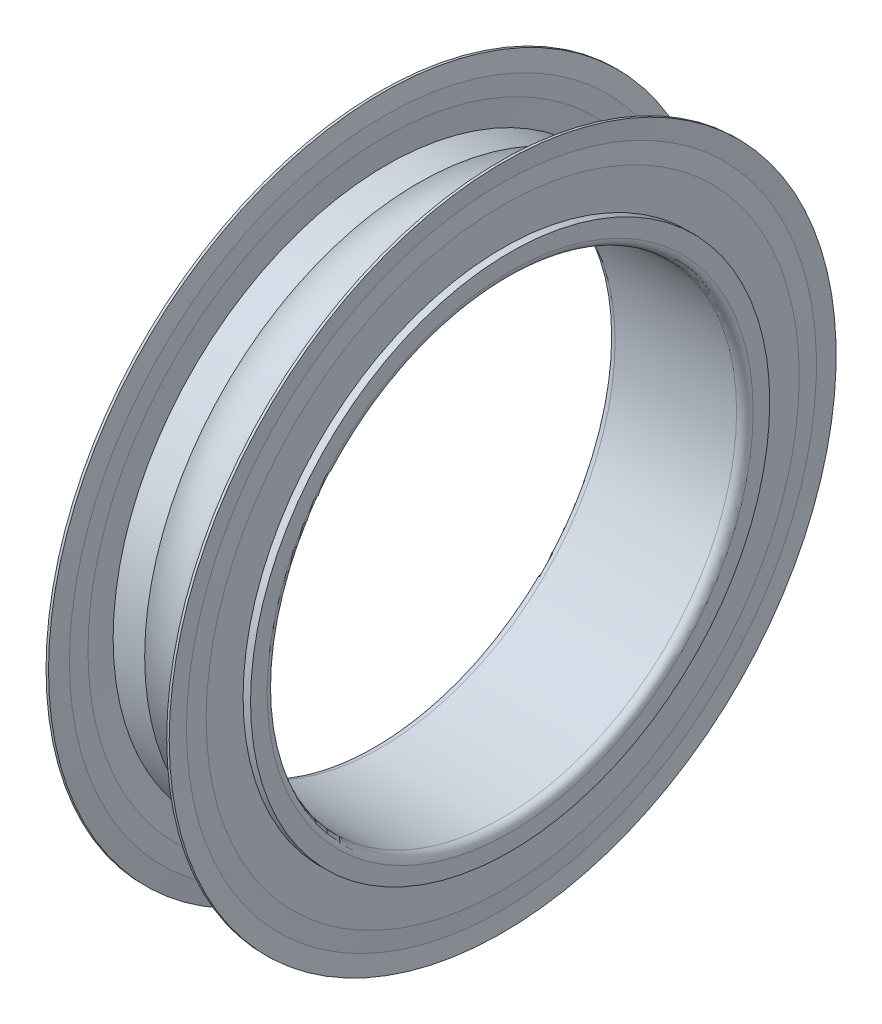
ISO-10303-21;
HEADER;
FILE_DESCRIPTION(('STEP AP214'),'2;1');
FILE_NAME('part.step','',(''),(''),'','','');
FILE_SCHEMA(('AUTOMOTIVE_DESIGN { 1 0 10303 214 1 1 1 1 }'));
ENDSEC;
DATA;
#1=APPLICATION_CONTEXT('core data for automotive mechanical design processes');
#2=APPLICATION_PROTOCOL_DEFINITION('international standard','automotive_design',2000,#1);
#3=PRODUCT_CONTEXT('',#1,'mechanical');
#4=PRODUCT('Part','Part','',(#3));
#5=PRODUCT_RELATED_PRODUCT_CATEGORY('part','',(#4));
#6=PRODUCT_DEFINITION_FORMATION('','',#4);
#7=PRODUCT_DEFINITION_CONTEXT('part definition',#1,'design');
#8=PRODUCT_DEFINITION('design','',#6,#7);
#9=PRODUCT_DEFINITION_SHAPE('','',#8);
#10=(LENGTH_UNIT() NAMED_UNIT(*) SI_UNIT(.MILLI.,.METRE.));
#11=(NAMED_UNIT(*) PLANE_ANGLE_UNIT() SI_UNIT($,.RADIAN.));
#12=(NAMED_UNIT(*) SI_UNIT($,.STERADIAN.) SOLID_ANGLE_UNIT());
#13=UNCERTAINTY_MEASURE_WITH_UNIT(LENGTH_MEASURE(1.E-05),#10,'distance_accuracy_value','');
#14=(GEOMETRIC_REPRESENTATION_CONTEXT(3) GLOBAL_UNCERTAINTY_ASSIGNED_CONTEXT((#13)) GLOBAL_UNIT_ASSIGNED_CONTEXT((#10,
#11,#12)) REPRESENTATION_CONTEXT('',''));
#15=CARTESIAN_POINT('',(0.,0.,0.));
#16=DIRECTION('',(0.,0.,1.));
#17=DIRECTION('',(1.,0.,0.));
#18=AXIS2_PLACEMENT_3D('',#15,#16,#17);
#19=CARTESIAN_POINT('',(0.,-9.6568452019928,-9.4));
#20=DIRECTION('',(-1.,0.,0.));
#21=DIRECTION('',(0.,0.,1.));
#22=AXIS2_PLACEMENT_3D('',#19,#20,#21);
#23=PLANE('',#22);
#24=CARTESIAN_POINT('',(0.,0.,0.));
#25=DIRECTION('',(-1.,0.,0.));
#26=DIRECTION('',(0.,0.,-1.));
#27=AXIS2_PLACEMENT_3D('',#24,#25,#26);
#28=CIRCLE('',#27,9.4);
#29=CARTESIAN_POINT('',(0.,0.,-9.4));
#30=VERTEX_POINT('',#29);
#31=EDGE_CURVE('E104',#30,#30,#28,.F.);
#32=ORIENTED_EDGE('',*,*,#31,.F.);
#33=EDGE_LOOP('',(#32));
#34=FACE_BOUND('',#33,.T.);
#35=CARTESIAN_POINT('',(0.,0.,0.));
#36=DIRECTION('',(1.,0.,0.));
#37=DIRECTION('',(0.,0.,1.));
#38=AXIS2_PLACEMENT_3D('',#35,#36,#37);
#39=CIRCLE('',#38,8.8);
#40=CARTESIAN_POINT('',(0.,0.,8.8));
#41=VERTEX_POINT('',#40);
#42=EDGE_CURVE('E101',#41,#41,#39,.T.);
#43=ORIENTED_EDGE('',*,*,#42,.T.);
#44=EDGE_LOOP('',(#43));
#45=FACE_BOUND('',#44,.T.);
#46=ADVANCED_FACE('F15',(#34,#45),#23,.T.);
#47=CARTESIAN_POINT('',(5.,-9.6568452019928,9.4));
#48=DIRECTION('',(1.,0.,0.));
#49=DIRECTION('',(0.,0.,-1.));
#50=AXIS2_PLACEMENT_3D('',#47,#48,#49);
#51=PLANE('',#50);
#52=CARTESIAN_POINT('',(5.,0.,0.));
#53=DIRECTION('',(1.,0.,0.));
#54=DIRECTION('',(0.,0.,1.));
#55=AXIS2_PLACEMENT_3D('',#52,#53,#54);
#56=CIRCLE('',#55,9.4);
#57=CARTESIAN_POINT('',(5.,0.,9.4));
#58=VERTEX_POINT('',#57);
#59=EDGE_CURVE('E98',#58,#58,#56,.T.);
#60=ORIENTED_EDGE('',*,*,#59,.T.);
#61=EDGE_LOOP('',(#60));
#62=FACE_BOUND('',#61,.T.);
#63=CARTESIAN_POINT('',(5.,0.,0.));
#64=DIRECTION('',(-1.,0.,0.));
#65=DIRECTION('',(0.,0.,-1.));
#66=AXIS2_PLACEMENT_3D('',#63,#64,#65);
#67=CIRCLE('',#66,8.80000005419997);
#68=CARTESIAN_POINT('',(5.,0.,-8.80000005419997));
#69=VERTEX_POINT('',#68);
#70=EDGE_CURVE('E95',#69,#69,#67,.F.);
#71=ORIENTED_EDGE('',*,*,#70,.F.);
#72=EDGE_LOOP('',(#71));
#73=FACE_BOUND('',#72,.T.);
#74=ADVANCED_FACE('F112',(#62,#73),#51,.T.);
#75=CARTESIAN_POINT('',(0.524,-10.1705071808222,9.9));
#76=DIRECTION('',(-1.,0.,0.));
#77=DIRECTION('',(0.,1.,0.));
#78=AXIS2_PLACEMENT_3D('',#75,#76,#77);
#79=PLANE('',#78);
#80=CARTESIAN_POINT('',(0.524,0.,0.));
#81=DIRECTION('',(-1.,0.,0.));
#82=DIRECTION('',(0.,0.,-1.));
#83=AXIS2_PLACEMENT_3D('',#80,#81,#82);
#84=CIRCLE('',#83,9.9);
#85=CARTESIAN_POINT('',(0.524,0.,-9.9));
#86=VERTEX_POINT('',#85);
#87=EDGE_CURVE('E92',#86,#86,#84,.T.);
#88=ORIENTED_EDGE('',*,*,#87,.T.);
#89=EDGE_LOOP('',(#88));
#90=FACE_BOUND('',#89,.T.);
#91=CARTESIAN_POINT('',(0.524,0.,0.));
#92=DIRECTION('',(1.,0.,0.));
#93=DIRECTION('',(0.,0.,1.));
#94=AXIS2_PLACEMENT_3D('',#91,#92,#93);
#95=CIRCLE('',#94,9.6183333333333);
#96=CARTESIAN_POINT('',(0.524,0.,9.6183333333333));
#97=VERTEX_POINT('',#96);
#98=EDGE_CURVE('E89',#97,#97,#95,.T.);
#99=ORIENTED_EDGE('',*,*,#98,.T.);
#100=EDGE_LOOP('',(#99));
#101=FACE_BOUND('',#100,.T.);
#102=ADVANCED_FACE('F367',(#90,#101),#79,.T.);
#103=CARTESIAN_POINT('',(4.476,-10.1705071808222,-9.9));
#104=DIRECTION('',(1.,0.,0.));
#105=DIRECTION('',(0.,1.,0.));
#106=AXIS2_PLACEMENT_3D('',#103,#104,#105);
#107=PLANE('',#106);
#108=CARTESIAN_POINT('',(4.476,0.,0.));
#109=DIRECTION('',(1.,0.,0.));
#110=DIRECTION('',(0.,0.,1.));
#111=AXIS2_PLACEMENT_3D('',#108,#109,#110);
#112=CIRCLE('',#111,9.9);
#113=CARTESIAN_POINT('',(4.476,0.,9.9));
#114=VERTEX_POINT('',#113);
#115=EDGE_CURVE('E86',#114,#114,#112,.T.);
#116=ORIENTED_EDGE('',*,*,#115,.T.);
#117=EDGE_LOOP('',(#116));
#118=FACE_BOUND('',#117,.T.);
#119=CARTESIAN_POINT('',(4.476,0.,0.));
#120=DIRECTION('',(-1.,0.,0.));
#121=DIRECTION('',(0.,0.,-1.));
#122=AXIS2_PLACEMENT_3D('',#119,#120,#121);
#123=CIRCLE('',#122,9.6183333333333);
#124=CARTESIAN_POINT('',(4.476,0.,-9.6183333333333));
#125=VERTEX_POINT('',#124);
#126=EDGE_CURVE('E83',#125,#125,#123,.F.);
#127=ORIENTED_EDGE('',*,*,#126,.F.);
#128=EDGE_LOOP('',(#127));
#129=FACE_BOUND('',#128,.T.);
#130=ADVANCED_FACE('F357',(#118,#129),#107,.T.);
#131=CARTESIAN_POINT('',(0.27,-11.0308909889194,-10.7375));
#132=DIRECTION('',(-1.,0.,0.));
#133=DIRECTION('',(0.,0.,1.));
#134=AXIS2_PLACEMENT_3D('',#131,#132,#133);
#135=PLANE('',#134);
#136=CARTESIAN_POINT('',(0.27,0.,0.));
#137=DIRECTION('',(-1.,0.,0.));
#138=DIRECTION('',(0.,0.,-1.));
#139=AXIS2_PLACEMENT_3D('',#136,#137,#138);
#140=CIRCLE('',#139,10.7375000000001);
#141=CARTESIAN_POINT('',(0.27,0.,-10.7375000000001));
#142=VERTEX_POINT('',#141);
#143=EDGE_CURVE('E80',#142,#142,#140,.F.);
#144=ORIENTED_EDGE('',*,*,#143,.F.);
#145=EDGE_LOOP('',(#144));
#146=FACE_BOUND('',#145,.T.);
#147=CARTESIAN_POINT('',(0.27,0.,0.));
#148=DIRECTION('',(1.,0.,0.));
#149=DIRECTION('',(0.,0.,1.));
#150=AXIS2_PLACEMENT_3D('',#147,#148,#149);
#151=CIRCLE('',#150,9.4);
#152=CARTESIAN_POINT('',(0.27,0.,9.4));
#153=VERTEX_POINT('',#152);
#154=EDGE_CURVE('E77',#153,#153,#151,.T.);
#155=ORIENTED_EDGE('',*,*,#154,.T.);
#156=EDGE_LOOP('',(#155));
#157=FACE_BOUND('',#156,.T.);
#158=ADVANCED_FACE('F347',(#146,#157),#135,.T.);
#159=CARTESIAN_POINT('',(0.45,-11.7179138920458,11.40625));
#160=DIRECTION('',(1.,0.,0.));
#161=DIRECTION('',(0.,0.,-1.));
#162=AXIS2_PLACEMENT_3D('',#159,#160,#161);
#163=PLANE('',#162);
#164=CARTESIAN_POINT('',(0.45,0.,0.));
#165=DIRECTION('',(1.,0.,0.));
#166=DIRECTION('',(0.,0.,1.));
#167=AXIS2_PLACEMENT_3D('',#164,#165,#166);
#168=CIRCLE('',#167,11.40625);
#169=CARTESIAN_POINT('',(0.45,0.,11.40625));
#170=VERTEX_POINT('',#169);
#171=EDGE_CURVE('E74',#170,#170,#168,.T.);
#172=ORIENTED_EDGE('',*,*,#171,.T.);
#173=EDGE_LOOP('',(#172));
#174=FACE_BOUND('',#173,.T.);
#175=CARTESIAN_POINT('',(0.45,0.,0.));
#176=DIRECTION('',(-1.,0.,0.));
#177=DIRECTION('',(0.,0.,-1.));
#178=AXIS2_PLACEMENT_3D('',#175,#176,#177);
#179=CIRCLE('',#178,10.7375);
#180=CARTESIAN_POINT('',(0.45,0.,-10.7375));
#181=VERTEX_POINT('',#180);
#182=EDGE_CURVE('E71',#181,#181,#179,.F.);
#183=ORIENTED_EDGE('',*,*,#182,.F.);
#184=EDGE_LOOP('',(#183));
#185=FACE_BOUND('',#184,.T.);
#186=ADVANCED_FACE('F338',(#174,#185),#163,.T.);
#187=CARTESIAN_POINT('',(4.55,-11.7179138920458,-11.40625));
#188=DIRECTION('',(-1.,0.,0.));
#189=DIRECTION('',(0.,0.,1.));
#190=AXIS2_PLACEMENT_3D('',#187,#188,#189);
#191=PLANE('',#190);
#192=CARTESIAN_POINT('',(4.55,0.,0.));
#193=DIRECTION('',(-1.,0.,0.));
#194=DIRECTION('',(0.,0.,-1.));
#195=AXIS2_PLACEMENT_3D('',#192,#193,#194);
#196=CIRCLE('',#195,11.40625);
#197=CARTESIAN_POINT('',(4.55,0.,-11.40625));
#198=VERTEX_POINT('',#197);
#199=EDGE_CURVE('E68',#198,#198,#196,.F.);
#200=ORIENTED_EDGE('',*,*,#199,.F.);
#201=EDGE_LOOP('',(#200));
#202=FACE_BOUND('',#201,.T.);
#203=CARTESIAN_POINT('',(4.55,0.,0.));
#204=DIRECTION('',(1.,0.,0.));
#205=DIRECTION('',(0.,0.,1.));
#206=AXIS2_PLACEMENT_3D('',#203,#204,#205);
#207=CIRCLE('',#206,10.7375);
#208=CARTESIAN_POINT('',(4.55,0.,10.7375));
#209=VERTEX_POINT('',#208);
#210=EDGE_CURVE('E65',#209,#209,#207,.T.);
#211=ORIENTED_EDGE('',*,*,#210,.T.);
#212=EDGE_LOOP('',(#211));
#213=FACE_BOUND('',#212,.T.);
#214=ADVANCED_FACE('F130',(#202,#213),#191,.T.);
#215=CARTESIAN_POINT('',(4.73,-11.0308909953615,10.7375));
#216=DIRECTION('',(1.,0.,0.));
#217=DIRECTION('',(0.,0.,-1.));
#218=AXIS2_PLACEMENT_3D('',#215,#216,#217);
#219=PLANE('',#218);
#220=CARTESIAN_POINT('',(4.73,0.,0.));
#221=DIRECTION('',(1.,0.,0.));
#222=DIRECTION('',(0.,0.,1.));
#223=AXIS2_PLACEMENT_3D('',#220,#221,#222);
#224=CIRCLE('',#223,10.7375);
#225=CARTESIAN_POINT('',(4.73,0.,10.7375));
#226=VERTEX_POINT('',#225);
#227=EDGE_CURVE('E62',#226,#226,#224,.T.);
#228=ORIENTED_EDGE('',*,*,#227,.T.);
#229=EDGE_LOOP('',(#228));
#230=FACE_BOUND('',#229,.T.);
#231=CARTESIAN_POINT('',(4.73,0.,0.));
#232=DIRECTION('',(-1.,0.,0.));
#233=DIRECTION('',(0.,0.,-1.));
#234=AXIS2_PLACEMENT_3D('',#231,#232,#233);
#235=CIRCLE('',#234,9.4);
#236=CARTESIAN_POINT('',(4.73,0.,-9.4));
#237=VERTEX_POINT('',#236);
#238=EDGE_CURVE('E59',#237,#237,#235,.F.);
#239=ORIENTED_EDGE('',*,*,#238,.F.);
#240=EDGE_LOOP('',(#239));
#241=FACE_BOUND('',#240,.T.);
#242=ADVANCED_FACE('F119',(#230,#241),#219,.T.);
#243=CARTESIAN_POINT('',(0.299999999999936,0.,0.));
#244=DIRECTION('',(1.,0.,0.));
#245=DIRECTION('',(0.,0.,1.));
#246=AXIS2_PLACEMENT_3D('',#243,#244,#245);
#247=TOROIDAL_SURFACE('',#246,8.8,0.299999999999936);
#248=CARTESIAN_POINT('',(0.3,0.,0.));
#249=DIRECTION('',(1.,0.,0.));
#250=DIRECTION('',(0.,0.,1.));
#251=AXIS2_PLACEMENT_3D('',#248,#249,#250);
#252=CIRCLE('',#251,8.50000000000006);
#253=CARTESIAN_POINT('',(0.3,0.,8.50000000000006));
#254=VERTEX_POINT('',#253);
#255=EDGE_CURVE('E56',#254,#254,#252,.T.);
#256=ORIENTED_EDGE('',*,*,#255,.T.);
#257=EDGE_LOOP('',(#256));
#258=FACE_BOUND('',#257,.T.);
#259=ORIENTED_EDGE('',*,*,#42,.F.);
#260=EDGE_LOOP('',(#259));
#261=FACE_BOUND('',#260,.T.);
#262=ADVANCED_FACE('F116',(#258,#261),#247,.T.);
#263=CARTESIAN_POINT('',(50.,0.,0.));
#264=DIRECTION('',(1.,0.,0.));
#265=DIRECTION('',(0.,0.,1.));
#266=AXIS2_PLACEMENT_3D('',#263,#264,#265);
#267=CYLINDRICAL_SURFACE('',#266,8.5);
#268=CARTESIAN_POINT('',(4.7,0.,0.));
#269=DIRECTION('',(1.,0.,0.));
#270=DIRECTION('',(0.,0.,1.));
#271=AXIS2_PLACEMENT_3D('',#268,#269,#270);
#272=CIRCLE('',#271,8.5);
#273=CARTESIAN_POINT('',(4.7,0.,8.5));
#274=VERTEX_POINT('',#273);
#275=EDGE_CURVE('E53',#274,#274,#272,.T.);
#276=ORIENTED_EDGE('',*,*,#275,.T.);
#277=EDGE_LOOP('',(#276));
#278=FACE_BOUND('',#277,.T.);
#279=ORIENTED_EDGE('',*,*,#255,.F.);
#280=EDGE_LOOP('',(#279));
#281=FACE_BOUND('',#280,.T.);
#282=ADVANCED_FACE('F118',(#278,#281),#267,.F.);
#283=CARTESIAN_POINT('',(4.70000000000013,0.,0.));
#284=DIRECTION('',(1.,0.,0.));
#285=DIRECTION('',(0.,0.,1.));
#286=AXIS2_PLACEMENT_3D('',#283,#284,#285);
#287=TOROIDAL_SURFACE('',#286,8.79999999999988,0.299999999999875);
#288=ORIENTED_EDGE('',*,*,#70,.T.);
#289=EDGE_LOOP('',(#288));
#290=FACE_BOUND('',#289,.T.);
#291=ORIENTED_EDGE('',*,*,#275,.F.);
#292=EDGE_LOOP('',(#291));
#293=FACE_BOUND('',#292,.T.);
#294=ADVANCED_FACE('F127',(#290,#293),#287,.T.);
#295=CARTESIAN_POINT('',(50.,0.,0.));
#296=DIRECTION('',(1.,0.,0.));
#297=DIRECTION('',(0.,0.,1.));
#298=AXIS2_PLACEMENT_3D('',#295,#296,#297);
#299=CYLINDRICAL_SURFACE('',#298,9.4);
#300=ORIENTED_EDGE('',*,*,#154,.F.);
#301=EDGE_LOOP('',(#300));
#302=FACE_BOUND('',#301,.T.);
#303=ORIENTED_EDGE('',*,*,#31,.T.);
#304=EDGE_LOOP('',(#303));
#305=FACE_BOUND('',#304,.T.);
#306=ADVANCED_FACE('F108',(#302,#305),#299,.T.);
#307=CARTESIAN_POINT('',(0.305666666666617,0.,0.));
#308=DIRECTION('',(1.,0.,0.));
#309=DIRECTION('',(0.,0.,1.));
#310=AXIS2_PLACEMENT_3D('',#307,#308,#309);
#311=TOROIDAL_SURFACE('',#310,9.61833333333338,0.218333333333383);
#312=ORIENTED_EDGE('',*,*,#98,.F.);
#313=EDGE_LOOP('',(#312));
#314=FACE_BOUND('',#313,.T.);
#315=CARTESIAN_POINT('',(0.360470355848265,0.,0.));
#316=DIRECTION('',(1.,0.,0.));
#317=DIRECTION('',(0.,0.,1.));
#318=AXIS2_PLACEMENT_3D('',#315,#316,#317);
#319=CIRCLE('',#318,9.40699001052296);
#320=CARTESIAN_POINT('',(0.360470355848265,0.,9.40699001052296));
#321=VERTEX_POINT('',#320);
#322=EDGE_CURVE('E50',#321,#321,#319,.T.);
#323=ORIENTED_EDGE('',*,*,#322,.T.);
#324=EDGE_LOOP('',(#323));
#325=FACE_BOUND('',#324,.T.);
#326=ADVANCED_FACE('F140',(#314,#325),#311,.F.);
#327=CARTESIAN_POINT('',(4.69433333333344,0.,0.));
#328=DIRECTION('',(1.,0.,0.));
#329=DIRECTION('',(0.,1.16855870569574E-09,1.));
#330=AXIS2_PLACEMENT_3D('',#327,#328,#329);
#331=TOROIDAL_SURFACE('',#330,9.61833333333344,0.218333333333437);
#332=CARTESIAN_POINT('',(4.63952964415175,0.,0.));
#333=DIRECTION('',(-1.,0.,0.));
#334=DIRECTION('',(0.,0.,-1.));
#335=AXIS2_PLACEMENT_3D('',#332,#333,#334);
#336=CIRCLE('',#335,9.40699001052298);
#337=CARTESIAN_POINT('',(4.63952964415175,0.,-9.40699001052298));
#338=VERTEX_POINT('',#337);
#339=EDGE_CURVE('E47',#338,#338,#336,.T.);
#340=ORIENTED_EDGE('',*,*,#339,.T.);
#341=EDGE_LOOP('',(#340));
#342=FACE_BOUND('',#341,.T.);
#343=ORIENTED_EDGE('',*,*,#126,.T.);
#344=EDGE_LOOP('',(#343));
#345=FACE_BOUND('',#344,.T.);
#346=ADVANCED_FACE('F144',(#342,#345),#331,.F.);
#347=CARTESIAN_POINT('',(50.,0.,0.));
#348=DIRECTION('',(1.,0.,0.));
#349=DIRECTION('',(0.,0.,1.));
#350=AXIS2_PLACEMENT_3D('',#347,#348,#349);
#351=CYLINDRICAL_SURFACE('',#350,9.4);
#352=ORIENTED_EDGE('',*,*,#59,.F.);
#353=EDGE_LOOP('',(#352));
#354=FACE_BOUND('',#353,.T.);
#355=ORIENTED_EDGE('',*,*,#238,.T.);
#356=EDGE_LOOP('',(#355));
#357=FACE_BOUND('',#356,.T.);
#358=ADVANCED_FACE('F148',(#354,#357),#351,.T.);
#359=CARTESIAN_POINT('',(50.,0.,0.));
#360=DIRECTION('',(1.,0.,0.));
#361=DIRECTION('',(0.,0.,1.));
#362=AXIS2_PLACEMENT_3D('',#359,#360,#361);
#363=CYLINDRICAL_SURFACE('',#362,9.9);
#364=CARTESIAN_POINT('',(3.3335407908435,0.,0.));
#365=DIRECTION('',(1.,0.,0.));
#366=DIRECTION('',(0.,0.,1.));
#367=AXIS2_PLACEMENT_3D('',#364,#365,#366);
#368=CIRCLE('',#367,9.9);
#369=CARTESIAN_POINT('',(3.3335407908435,0.,9.9));
#370=VERTEX_POINT('',#369);
#371=EDGE_CURVE('E44',#370,#370,#368,.T.);
#372=ORIENTED_EDGE('',*,*,#371,.T.);
#373=EDGE_LOOP('',(#372));
#374=FACE_BOUND('',#373,.T.);
#375=ORIENTED_EDGE('',*,*,#115,.F.);
#376=EDGE_LOOP('',(#375));
#377=FACE_BOUND('',#376,.T.);
#378=ADVANCED_FACE('F152',(#374,#377),#363,.T.);
#379=CARTESIAN_POINT('',(2.5,0.,0.));
#380=DIRECTION('',(1.,0.,0.));
#381=DIRECTION('',(0.,0.,1.));
#382=AXIS2_PLACEMENT_3D('',#379,#380,#381);
#383=TOROIDAL_SURFACE('',#382,10.75,1.1905);
#384=ORIENTED_EDGE('',*,*,#371,.F.);
#385=EDGE_LOOP('',(#384));
#386=FACE_BOUND('',#385,.T.);
#387=CARTESIAN_POINT('',(1.6664592091565,0.,0.));
#388=DIRECTION('',(1.,0.,0.));
#389=DIRECTION('',(0.,0.,1.));
#390=AXIS2_PLACEMENT_3D('',#387,#388,#389);
#391=CIRCLE('',#390,9.9);
#392=CARTESIAN_POINT('',(1.6664592091565,0.,9.9));
#393=VERTEX_POINT('',#392);
#394=EDGE_CURVE('E41',#393,#393,#391,.T.);
#395=ORIENTED_EDGE('',*,*,#394,.T.);
#396=EDGE_LOOP('',(#395));
#397=FACE_BOUND('',#396,.T.);
#398=ADVANCED_FACE('F156',(#386,#397),#383,.F.);
#399=CARTESIAN_POINT('',(50.,0.,0.));
#400=DIRECTION('',(1.,0.,0.));
#401=DIRECTION('',(0.,0.,1.));
#402=AXIS2_PLACEMENT_3D('',#399,#400,#401);
#403=CYLINDRICAL_SURFACE('',#402,9.9);
#404=ORIENTED_EDGE('',*,*,#87,.F.);
#405=EDGE_LOOP('',(#404));
#406=FACE_BOUND('',#405,.T.);
#407=ORIENTED_EDGE('',*,*,#394,.F.);
#408=EDGE_LOOP('',(#407));
#409=FACE_BOUND('',#408,.T.);
#410=ADVANCED_FACE('F160',(#406,#409),#403,.T.);
#411=CARTESIAN_POINT('',(0.45,0.,0.));
#412=DIRECTION('',(1.,0.,0.));
#413=DIRECTION('',(0.,0.,1.));
#414=AXIS2_PLACEMENT_3D('',#411,#412,#413);
#415=CONICAL_SURFACE('',#414,10.7375,1.50360789266071);
#416=ORIENTED_EDGE('',*,*,#182,.T.);
#417=EDGE_LOOP('',(#416));
#418=FACE_BOUND('',#417,.T.);
#419=ORIENTED_EDGE('',*,*,#322,.F.);
#420=EDGE_LOOP('',(#419));
#421=FACE_BOUND('',#420,.T.);
#422=ADVANCED_FACE('F164',(#418,#421),#415,.F.);
#423=CARTESIAN_POINT('',(50.,0.,0.));
#424=DIRECTION('',(1.,0.,0.));
#425=DIRECTION('',(0.,1.92326277466545E-10,1.));
#426=AXIS2_PLACEMENT_3D('',#423,#424,#425);
#427=CYLINDRICAL_SURFACE('',#426,12.075);
#428=CARTESIAN_POINT('',(0.270000000000003,0.,0.));
#429=DIRECTION('',(1.,0.,0.));
#430=DIRECTION('',(0.,0.,1.));
#431=AXIS2_PLACEMENT_3D('',#428,#429,#430);
#432=CIRCLE('',#431,12.075);
#433=CARTESIAN_POINT('',(0.270000000000003,0.,12.075));
#434=VERTEX_POINT('',#433);
#435=EDGE_CURVE('E38',#434,#434,#432,.T.);
#436=ORIENTED_EDGE('',*,*,#435,.T.);
#437=EDGE_LOOP('',(#436));
#438=FACE_BOUND('',#437,.T.);
#439=CARTESIAN_POINT('',(0.359999999999999,0.,0.));
#440=DIRECTION('',(-1.,0.,0.));
#441=DIRECTION('',(0.,0.,-1.));
#442=AXIS2_PLACEMENT_3D('',#439,#440,#441);
#443=CIRCLE('',#442,12.075);
#444=CARTESIAN_POINT('',(0.359999999999999,0.,-12.075));
#445=VERTEX_POINT('',#444);
#446=EDGE_CURVE('E35',#445,#445,#443,.F.);
#447=ORIENTED_EDGE('',*,*,#446,.F.);
#448=EDGE_LOOP('',(#447));
#449=FACE_BOUND('',#448,.T.);
#450=ADVANCED_FACE('F168',(#438,#449),#427,.T.);
#451=CARTESIAN_POINT('',(0.27,0.,0.));
#452=DIRECTION('',(-1.,0.,0.));
#453=DIRECTION('',(0.,0.,-1.));
#454=AXIS2_PLACEMENT_3D('',#451,#452,#453);
#455=CONICAL_SURFACE('',#454,12.075,1.5036078926607);
#456=ORIENTED_EDGE('',*,*,#435,.F.);
#457=EDGE_LOOP('',(#456));
#458=FACE_BOUND('',#457,.T.);
#459=CARTESIAN_POINT('',(0.315000000000003,0.,0.));
#460=DIRECTION('',(1.,0.,0.));
#461=DIRECTION('',(0.,0.,1.));
#462=AXIS2_PLACEMENT_3D('',#459,#460,#461);
#463=CIRCLE('',#462,11.40625);
#464=CARTESIAN_POINT('',(0.315000000000003,0.,11.40625));
#465=VERTEX_POINT('',#464);
#466=EDGE_CURVE('E30',#465,#465,#463,.T.);
#467=ORIENTED_EDGE('',*,*,#466,.T.);
#468=EDGE_LOOP('',(#467));
#469=FACE_BOUND('',#468,.T.);
#470=ADVANCED_FACE('F172',(#458,#469),#455,.F.);
#471=CARTESIAN_POINT('',(0.315,0.,0.));
#472=DIRECTION('',(1.,0.,0.));
#473=DIRECTION('',(0.,1.16841526488096E-09,1.));
#474=AXIS2_PLACEMENT_3D('',#471,#472,#473);
#475=CONICAL_SURFACE('',#474,11.40625,1.5036078926607);
#476=ORIENTED_EDGE('',*,*,#143,.T.);
#477=EDGE_LOOP('',(#476));
#478=FACE_BOUND('',#477,.T.);
#479=ORIENTED_EDGE('',*,*,#466,.F.);
#480=EDGE_LOOP('',(#479));
#481=FACE_BOUND('',#480,.T.);
#482=ADVANCED_FACE('F176',(#478,#481),#475,.T.);
#483=CARTESIAN_POINT('',(0.359999999999999,0.,0.));
#484=DIRECTION('',(-1.,0.,0.));
#485=DIRECTION('',(0.,0.,-1.));
#486=AXIS2_PLACEMENT_3D('',#483,#484,#485);
#487=CONICAL_SURFACE('',#486,12.075,1.43702065506807);
#488=ORIENTED_EDGE('',*,*,#446,.T.);
#489=EDGE_LOOP('',(#488));
#490=FACE_BOUND('',#489,.T.);
#491=ORIENTED_EDGE('',*,*,#171,.F.);
#492=EDGE_LOOP('',(#491));
#493=FACE_BOUND('',#492,.T.);
#494=ADVANCED_FACE('F180',(#490,#493),#487,.T.);
#495=CARTESIAN_POINT('',(4.55,0.,0.));
#496=DIRECTION('',(-1.,0.,0.));
#497=DIRECTION('',(0.,0.,-1.));
#498=AXIS2_PLACEMENT_3D('',#495,#496,#497);
#499=CONICAL_SURFACE('',#498,10.7375,1.50360789266071);
#500=ORIENTED_EDGE('',*,*,#339,.F.);
#501=EDGE_LOOP('',(#500));
#502=FACE_BOUND('',#501,.T.);
#503=ORIENTED_EDGE('',*,*,#210,.F.);
#504=EDGE_LOOP('',(#503));
#505=FACE_BOUND('',#504,.T.);
#506=ADVANCED_FACE('F184',(#502,#505),#499,.F.);
#507=CARTESIAN_POINT('',(4.64,0.,0.));
#508=DIRECTION('',(1.,0.,0.));
#509=DIRECTION('',(0.,1.9234004423205E-10,1.));
#510=AXIS2_PLACEMENT_3D('',#507,#508,#509);
#511=CONICAL_SURFACE('',#510,12.075,1.43702065506807);
#512=ORIENTED_EDGE('',*,*,#199,.T.);
#513=EDGE_LOOP('',(#512));
#514=FACE_BOUND('',#513,.T.);
#515=CARTESIAN_POINT('',(4.64,0.,0.));
#516=DIRECTION('',(-1.,0.,0.));
#517=DIRECTION('',(0.,0.,-1.));
#518=AXIS2_PLACEMENT_3D('',#515,#516,#517);
#519=CIRCLE('',#518,12.075);
#520=CARTESIAN_POINT('',(4.64,0.,-12.075));
#521=VERTEX_POINT('',#520);
#522=EDGE_CURVE('E26',#521,#521,#519,.F.);
#523=ORIENTED_EDGE('',*,*,#522,.F.);
#524=EDGE_LOOP('',(#523));
#525=FACE_BOUND('',#524,.T.);
#526=ADVANCED_FACE('F188',(#514,#525),#511,.T.);
#527=CARTESIAN_POINT('',(4.685,0.,0.));
#528=DIRECTION('',(-1.,0.,0.));
#529=DIRECTION('',(0.,0.,-1.));
#530=AXIS2_PLACEMENT_3D('',#527,#528,#529);
#531=CONICAL_SURFACE('',#530,11.40625,1.50360789266071);
#532=ORIENTED_EDGE('',*,*,#227,.F.);
#533=EDGE_LOOP('',(#532));
#534=FACE_BOUND('',#533,.T.);
#535=CARTESIAN_POINT('',(4.685,0.,0.));
#536=DIRECTION('',(1.,0.,0.));
#537=DIRECTION('',(0.,0.,1.));
#538=AXIS2_PLACEMENT_3D('',#535,#536,#537);
#539=CIRCLE('',#538,11.40625);
#540=CARTESIAN_POINT('',(4.685,0.,11.40625));
#541=VERTEX_POINT('',#540);
#542=EDGE_CURVE('E22',#541,#541,#539,.T.);
#543=ORIENTED_EDGE('',*,*,#542,.T.);
#544=EDGE_LOOP('',(#543));
#545=FACE_BOUND('',#544,.T.);
#546=ADVANCED_FACE('F192',(#534,#545),#531,.T.);
#547=CARTESIAN_POINT('',(4.73,0.,0.));
#548=DIRECTION('',(1.,0.,0.));
#549=DIRECTION('',(0.,0.,1.));
#550=AXIS2_PLACEMENT_3D('',#547,#548,#549);
#551=CONICAL_SURFACE('',#550,12.075,1.50360789266071);
#552=CARTESIAN_POINT('',(4.73,0.,0.));
#553=DIRECTION('',(1.,0.,0.));
#554=DIRECTION('',(0.,0.,1.));
#555=AXIS2_PLACEMENT_3D('',#552,#553,#554);
#556=CIRCLE('',#555,12.075);
#557=CARTESIAN_POINT('',(4.73,0.,12.075));
#558=VERTEX_POINT('',#557);
#559=EDGE_CURVE('E10',#558,#558,#556,.T.);
#560=ORIENTED_EDGE('',*,*,#559,.T.);
#561=EDGE_LOOP('',(#560));
#562=FACE_BOUND('',#561,.T.);
#563=ORIENTED_EDGE('',*,*,#542,.F.);
#564=EDGE_LOOP('',(#563));
#565=FACE_BOUND('',#564,.T.);
#566=ADVANCED_FACE('F195',(#562,#565),#551,.F.);
#567=CARTESIAN_POINT('',(50.,0.,0.));
#568=DIRECTION('',(1.,0.,0.));
#569=DIRECTION('',(0.,7.69359809534162E-10,1.));
#570=AXIS2_PLACEMENT_3D('',#567,#568,#569);
#571=CYLINDRICAL_SURFACE('',#570,12.075);
#572=ORIENTED_EDGE('',*,*,#522,.T.);
#573=EDGE_LOOP('',(#572));
#574=FACE_BOUND('',#573,.T.);
#575=ORIENTED_EDGE('',*,*,#559,.F.);
#576=EDGE_LOOP('',(#575));
#577=FACE_BOUND('',#576,.T.);
#578=ADVANCED_FACE('F17',(#574,#577),#571,.T.);
#579=CLOSED_SHELL('',(#46,#74,#102,#130,#158,#186,#214,#242,#262,#282,#294,#306,#326,#346,#358,
#378,#398,#410,#422,#450,#470,#482,#494,#506,#526,#546,#566,#578));
#580=MANIFOLD_SOLID_BREP('B1',#579);
#581=ADVANCED_BREP_SHAPE_REPRESENTATION('',(#18,#580),#14);
#582=SHAPE_DEFINITION_REPRESENTATION(#9,#581);
ENDSEC;
END-ISO-10303-21;
